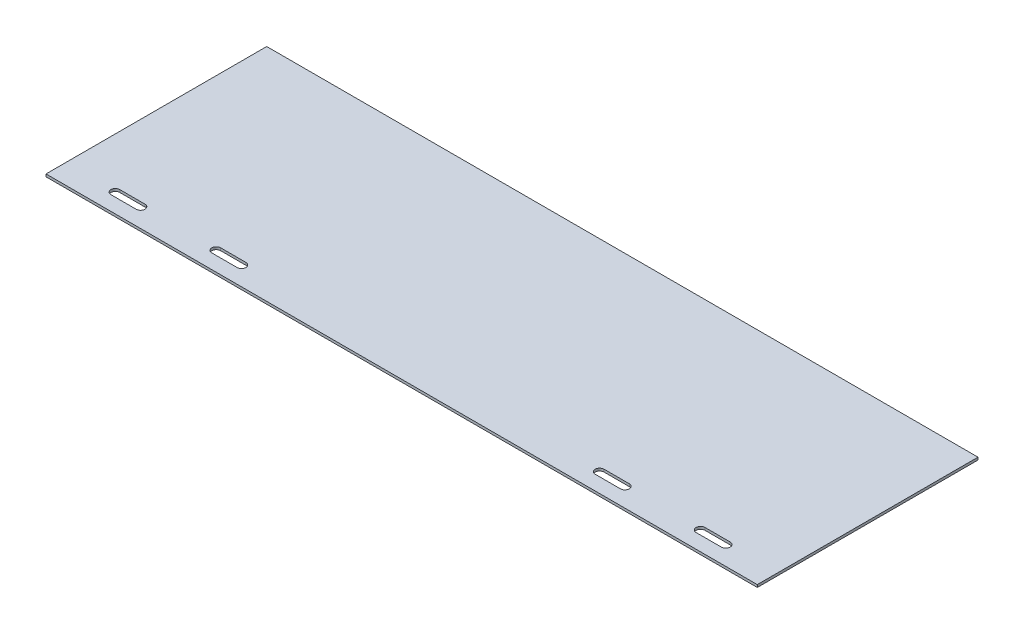
ISO-10303-21;
HEADER;
FILE_DESCRIPTION(('STEP AP214'),'2;1');
FILE_NAME('part.step','',(''),(''),'','','');
FILE_SCHEMA(('AUTOMOTIVE_DESIGN { 1 0 10303 214 1 1 1 1 }'));
ENDSEC;
DATA;
#1=APPLICATION_CONTEXT('core data for automotive mechanical design processes');
#2=APPLICATION_PROTOCOL_DEFINITION('international standard','automotive_design',2000,#1);
#3=PRODUCT_CONTEXT('',#1,'mechanical');
#4=PRODUCT('Part','Part','',(#3));
#5=PRODUCT_RELATED_PRODUCT_CATEGORY('part','',(#4));
#6=PRODUCT_DEFINITION_FORMATION('','',#4);
#7=PRODUCT_DEFINITION_CONTEXT('part definition',#1,'design');
#8=PRODUCT_DEFINITION('design','',#6,#7);
#9=PRODUCT_DEFINITION_SHAPE('','',#8);
#10=(LENGTH_UNIT() NAMED_UNIT(*) SI_UNIT(.MILLI.,.METRE.));
#11=(NAMED_UNIT(*) PLANE_ANGLE_UNIT() SI_UNIT($,.RADIAN.));
#12=(NAMED_UNIT(*) SI_UNIT($,.STERADIAN.) SOLID_ANGLE_UNIT());
#13=UNCERTAINTY_MEASURE_WITH_UNIT(LENGTH_MEASURE(1.E-05),#10,'distance_accuracy_value','');
#14=(GEOMETRIC_REPRESENTATION_CONTEXT(3) GLOBAL_UNCERTAINTY_ASSIGNED_CONTEXT((#13)) GLOBAL_UNIT_ASSIGNED_CONTEXT((#10,
#11,#12)) REPRESENTATION_CONTEXT('',''));
#15=CARTESIAN_POINT('',(0.,0.,0.));
#16=DIRECTION('',(0.,0.,1.));
#17=DIRECTION('',(1.,0.,0.));
#18=AXIS2_PLACEMENT_3D('',#15,#16,#17);
#19=CARTESIAN_POINT('',(0.,2.,0.));
#20=DIRECTION('',(0.,-1.,0.));
#21=DIRECTION('',(0.,0.,-1.));
#22=AXIS2_PLACEMENT_3D('',#19,#20,#21);
#23=PLANE('',#22);
#24=CARTESIAN_POINT('',(-242.,2.,72.5));
#25=DIRECTION('',(0.,1.,0.));
#26=DIRECTION('',(0.,0.,-1.));
#27=AXIS2_PLACEMENT_3D('',#24,#25,#26);
#28=CIRCLE('',#27,3.5);
#29=CARTESIAN_POINT('',(-242.,2.,69.));
#30=VERTEX_POINT('',#29);
#31=CARTESIAN_POINT('',(-242.,2.,76.));
#32=VERTEX_POINT('',#31);
#33=EDGE_CURVE('E188',#30,#32,#28,.T.);
#34=ORIENTED_EDGE('',*,*,#33,.F.);
#35=DIRECTION('',(-1.,0.,0.));
#36=VECTOR('',#35,1.);
#37=CARTESIAN_POINT('',(-242.,2.,69.));
#38=LINE('',#37,#36);
#39=CARTESIAN_POINT('',(-222.,2.,69.));
#40=VERTEX_POINT('',#39);
#41=EDGE_CURVE('E190',#40,#30,#38,.T.);
#42=ORIENTED_EDGE('',*,*,#41,.F.);
#43=CARTESIAN_POINT('',(-222.,2.,72.5));
#44=DIRECTION('',(0.,1.,0.));
#45=DIRECTION('',(0.,0.,-1.));
#46=AXIS2_PLACEMENT_3D('',#43,#44,#45);
#47=CIRCLE('',#46,3.5);
#48=CARTESIAN_POINT('',(-222.,2.,76.));
#49=VERTEX_POINT('',#48);
#50=EDGE_CURVE('E193',#49,#40,#47,.T.);
#51=ORIENTED_EDGE('',*,*,#50,.F.);
#52=DIRECTION('',(1.,0.,0.));
#53=VECTOR('',#52,1.);
#54=CARTESIAN_POINT('',(-242.,2.,76.));
#55=LINE('',#54,#53);
#56=EDGE_CURVE('E196',#32,#49,#55,.T.);
#57=ORIENTED_EDGE('',*,*,#56,.F.);
#58=EDGE_LOOP('',(#34,#42,#51,#57));
#59=FACE_BOUND('',#58,.T.);
#60=DIRECTION('',(1.,0.,0.));
#61=VECTOR('',#60,1.);
#62=CARTESIAN_POINT('',(162.,2.,69.));
#63=LINE('',#62,#61);
#64=CARTESIAN_POINT('',(142.,2.,69.));
#65=VERTEX_POINT('',#64);
#66=CARTESIAN_POINT('',(162.,2.,69.));
#67=VERTEX_POINT('',#66);
#68=EDGE_CURVE('E229',#65,#67,#63,.T.);
#69=ORIENTED_EDGE('',*,*,#68,.T.);
#70=CARTESIAN_POINT('',(162.,2.,72.5));
#71=DIRECTION('',(0.,-1.,0.));
#72=DIRECTION('',(0.,0.,-1.));
#73=AXIS2_PLACEMENT_3D('',#70,#71,#72);
#74=CIRCLE('',#73,3.5);
#75=CARTESIAN_POINT('',(162.,2.,76.));
#76=VERTEX_POINT('',#75);
#77=EDGE_CURVE('E219',#67,#76,#74,.T.);
#78=ORIENTED_EDGE('',*,*,#77,.T.);
#79=DIRECTION('',(-1.,0.,0.));
#80=VECTOR('',#79,1.);
#81=CARTESIAN_POINT('',(162.,2.,76.));
#82=LINE('',#81,#80);
#83=CARTESIAN_POINT('',(142.,2.,76.));
#84=VERTEX_POINT('',#83);
#85=EDGE_CURVE('E222',#76,#84,#82,.T.);
#86=ORIENTED_EDGE('',*,*,#85,.T.);
#87=CARTESIAN_POINT('',(142.,2.,72.5));
#88=DIRECTION('',(0.,-1.,0.));
#89=DIRECTION('',(0.,0.,-1.));
#90=AXIS2_PLACEMENT_3D('',#87,#88,#89);
#91=CIRCLE('',#90,3.5);
#92=EDGE_CURVE('E226',#84,#65,#91,.T.);
#93=ORIENTED_EDGE('',*,*,#92,.T.);
#94=EDGE_LOOP('',(#69,#78,#86,#93));
#95=FACE_BOUND('',#94,.T.);
#96=DIRECTION('',(1.,0.,0.));
#97=VECTOR('',#96,1.);
#98=CARTESIAN_POINT('',(242.,2.,69.));
#99=LINE('',#98,#97);
#100=CARTESIAN_POINT('',(222.,2.,69.));
#101=VERTEX_POINT('',#100);
#102=CARTESIAN_POINT('',(242.,2.,69.));
#103=VERTEX_POINT('',#102);
#104=EDGE_CURVE('E261',#101,#103,#99,.T.);
#105=ORIENTED_EDGE('',*,*,#104,.T.);
#106=CARTESIAN_POINT('',(242.,2.,72.5));
#107=DIRECTION('',(0.,-1.,0.));
#108=DIRECTION('',(0.,0.,-1.));
#109=AXIS2_PLACEMENT_3D('',#106,#107,#108);
#110=CIRCLE('',#109,3.5);
#111=CARTESIAN_POINT('',(242.,2.,76.));
#112=VERTEX_POINT('',#111);
#113=EDGE_CURVE('E251',#103,#112,#110,.T.);
#114=ORIENTED_EDGE('',*,*,#113,.T.);
#115=DIRECTION('',(-1.,0.,0.));
#116=VECTOR('',#115,1.);
#117=CARTESIAN_POINT('',(242.,2.,76.));
#118=LINE('',#117,#116);
#119=CARTESIAN_POINT('',(222.,2.,76.));
#120=VERTEX_POINT('',#119);
#121=EDGE_CURVE('E254',#112,#120,#118,.T.);
#122=ORIENTED_EDGE('',*,*,#121,.T.);
#123=CARTESIAN_POINT('',(222.,2.,72.5));
#124=DIRECTION('',(0.,-1.,0.));
#125=DIRECTION('',(0.,0.,-1.));
#126=AXIS2_PLACEMENT_3D('',#123,#124,#125);
#127=CIRCLE('',#126,3.5);
#128=EDGE_CURVE('E258',#120,#101,#127,.T.);
#129=ORIENTED_EDGE('',*,*,#128,.T.);
#130=EDGE_LOOP('',(#105,#114,#122,#129));
#131=FACE_BOUND('',#130,.T.);
#132=DIRECTION('',(0.,0.,-1.));
#133=VECTOR('',#132,1.);
#134=CARTESIAN_POINT('',(282.,2.,87.5));
#135=LINE('',#134,#133);
#136=CARTESIAN_POINT('',(282.,2.,87.5));
#137=VERTEX_POINT('',#136);
#138=CARTESIAN_POINT('',(282.,2.,-87.5));
#139=VERTEX_POINT('',#138);
#140=EDGE_CURVE('E283',#137,#139,#135,.T.);
#141=ORIENTED_EDGE('',*,*,#140,.T.);
#142=DIRECTION('',(-1.,0.,0.));
#143=VECTOR('',#142,1.);
#144=CARTESIAN_POINT('',(-282.,2.,-87.5));
#145=LINE('',#144,#143);
#146=CARTESIAN_POINT('',(-282.,2.,-87.5));
#147=VERTEX_POINT('',#146);
#148=EDGE_CURVE('E286',#139,#147,#145,.T.);
#149=ORIENTED_EDGE('',*,*,#148,.T.);
#150=DIRECTION('',(0.,0.,1.));
#151=VECTOR('',#150,1.);
#152=CARTESIAN_POINT('',(-282.,2.,87.5));
#153=LINE('',#152,#151);
#154=CARTESIAN_POINT('',(-282.,2.,87.5));
#155=VERTEX_POINT('',#154);
#156=EDGE_CURVE('E289',#147,#155,#153,.T.);
#157=ORIENTED_EDGE('',*,*,#156,.T.);
#158=DIRECTION('',(1.,0.,0.));
#159=VECTOR('',#158,1.);
#160=CARTESIAN_POINT('',(-282.,2.,87.5));
#161=LINE('',#160,#159);
#162=EDGE_CURVE('E291',#155,#137,#161,.T.);
#163=ORIENTED_EDGE('',*,*,#162,.T.);
#164=EDGE_LOOP('',(#141,#149,#157,#163));
#165=FACE_BOUND('',#164,.T.);
#166=CARTESIAN_POINT('',(-162.,2.,72.5));
#167=DIRECTION('',(0.,1.,0.));
#168=DIRECTION('',(0.,0.,-1.));
#169=AXIS2_PLACEMENT_3D('',#166,#167,#168);
#170=CIRCLE('',#169,3.5);
#171=CARTESIAN_POINT('',(-162.,2.,69.));
#172=VERTEX_POINT('',#171);
#173=CARTESIAN_POINT('',(-162.,2.,76.));
#174=VERTEX_POINT('',#173);
#175=EDGE_CURVE('E162',#172,#174,#170,.T.);
#176=ORIENTED_EDGE('',*,*,#175,.F.);
#177=DIRECTION('',(-1.,0.,0.));
#178=VECTOR('',#177,1.);
#179=CARTESIAN_POINT('',(-162.,2.,69.));
#180=LINE('',#179,#178);
#181=CARTESIAN_POINT('',(-142.,2.,69.));
#182=VERTEX_POINT('',#181);
#183=EDGE_CURVE('E154',#182,#172,#180,.T.);
#184=ORIENTED_EDGE('',*,*,#183,.F.);
#185=CARTESIAN_POINT('',(-142.,2.,72.5));
#186=DIRECTION('',(0.,1.,0.));
#187=DIRECTION('',(0.,0.,-1.));
#188=AXIS2_PLACEMENT_3D('',#185,#186,#187);
#189=CIRCLE('',#188,3.5);
#190=CARTESIAN_POINT('',(-142.,2.,76.));
#191=VERTEX_POINT('',#190);
#192=EDGE_CURVE('E161',#191,#182,#189,.T.);
#193=ORIENTED_EDGE('',*,*,#192,.F.);
#194=DIRECTION('',(1.,0.,0.));
#195=VECTOR('',#194,1.);
#196=CARTESIAN_POINT('',(-162.,2.,76.));
#197=LINE('',#196,#195);
#198=EDGE_CURVE('E166',#174,#191,#197,.T.);
#199=ORIENTED_EDGE('',*,*,#198,.F.);
#200=EDGE_LOOP('',(#176,#184,#193,#199));
#201=FACE_BOUND('',#200,.T.);
#202=ADVANCED_FACE('F17',(#59,#95,#131,#165,#201),#23,.F.);
#203=CARTESIAN_POINT('',(0.,0.,0.));
#204=DIRECTION('',(0.,-1.,0.));
#205=DIRECTION('',(0.,0.,-1.));
#206=AXIS2_PLACEMENT_3D('',#203,#204,#205);
#207=PLANE('',#206);
#208=DIRECTION('',(-1.,0.,0.));
#209=VECTOR('',#208,1.);
#210=CARTESIAN_POINT('',(-242.,0.,69.));
#211=LINE('',#210,#209);
#212=CARTESIAN_POINT('',(-222.,0.,69.));
#213=VERTEX_POINT('',#212);
#214=CARTESIAN_POINT('',(-242.,0.,69.));
#215=VERTEX_POINT('',#214);
#216=EDGE_CURVE('E201',#213,#215,#211,.T.);
#217=ORIENTED_EDGE('',*,*,#216,.T.);
#218=CARTESIAN_POINT('',(-242.,0.,72.5));
#219=DIRECTION('',(0.,1.,0.));
#220=DIRECTION('',(0.,0.,-1.));
#221=AXIS2_PLACEMENT_3D('',#218,#219,#220);
#222=CIRCLE('',#221,3.5);
#223=CARTESIAN_POINT('',(-242.,0.,76.));
#224=VERTEX_POINT('',#223);
#225=EDGE_CURVE('E184',#215,#224,#222,.T.);
#226=ORIENTED_EDGE('',*,*,#225,.T.);
#227=DIRECTION('',(1.,0.,0.));
#228=VECTOR('',#227,1.);
#229=CARTESIAN_POINT('',(-242.,0.,76.));
#230=LINE('',#229,#228);
#231=CARTESIAN_POINT('',(-222.,0.,76.));
#232=VERTEX_POINT('',#231);
#233=EDGE_CURVE('E191',#224,#232,#230,.T.);
#234=ORIENTED_EDGE('',*,*,#233,.T.);
#235=CARTESIAN_POINT('',(-222.,0.,72.5));
#236=DIRECTION('',(0.,1.,0.));
#237=DIRECTION('',(0.,0.,-1.));
#238=AXIS2_PLACEMENT_3D('',#235,#236,#237);
#239=CIRCLE('',#238,3.5);
#240=EDGE_CURVE('E204',#232,#213,#239,.T.);
#241=ORIENTED_EDGE('',*,*,#240,.T.);
#242=EDGE_LOOP('',(#217,#226,#234,#241));
#243=FACE_BOUND('',#242,.T.);
#244=CARTESIAN_POINT('',(162.,0.,72.5));
#245=DIRECTION('',(0.,-1.,0.));
#246=DIRECTION('',(0.,0.,-1.));
#247=AXIS2_PLACEMENT_3D('',#244,#245,#246);
#248=CIRCLE('',#247,3.5);
#249=CARTESIAN_POINT('',(162.,0.,69.));
#250=VERTEX_POINT('',#249);
#251=CARTESIAN_POINT('',(162.,0.,76.));
#252=VERTEX_POINT('',#251);
#253=EDGE_CURVE('E212',#250,#252,#248,.T.);
#254=ORIENTED_EDGE('',*,*,#253,.F.);
#255=DIRECTION('',(1.,0.,0.));
#256=VECTOR('',#255,1.);
#257=CARTESIAN_POINT('',(162.,0.,69.));
#258=LINE('',#257,#256);
#259=CARTESIAN_POINT('',(142.,0.,69.));
#260=VERTEX_POINT('',#259);
#261=EDGE_CURVE('E223',#260,#250,#258,.T.);
#262=ORIENTED_EDGE('',*,*,#261,.F.);
#263=CARTESIAN_POINT('',(142.,0.,72.5));
#264=DIRECTION('',(0.,-1.,0.));
#265=DIRECTION('',(0.,0.,-1.));
#266=AXIS2_PLACEMENT_3D('',#263,#264,#265);
#267=CIRCLE('',#266,3.5);
#268=CARTESIAN_POINT('',(142.,0.,76.));
#269=VERTEX_POINT('',#268);
#270=EDGE_CURVE('E237',#269,#260,#267,.T.);
#271=ORIENTED_EDGE('',*,*,#270,.F.);
#272=DIRECTION('',(-1.,0.,0.));
#273=VECTOR('',#272,1.);
#274=CARTESIAN_POINT('',(162.,0.,76.));
#275=LINE('',#274,#273);
#276=EDGE_CURVE('E234',#252,#269,#275,.T.);
#277=ORIENTED_EDGE('',*,*,#276,.F.);
#278=EDGE_LOOP('',(#254,#262,#271,#277));
#279=FACE_BOUND('',#278,.T.);
#280=CARTESIAN_POINT('',(242.,0.,72.5));
#281=DIRECTION('',(0.,-1.,0.));
#282=DIRECTION('',(0.,0.,-1.));
#283=AXIS2_PLACEMENT_3D('',#280,#281,#282);
#284=CIRCLE('',#283,3.5);
#285=CARTESIAN_POINT('',(242.,0.,69.));
#286=VERTEX_POINT('',#285);
#287=CARTESIAN_POINT('',(242.,0.,76.));
#288=VERTEX_POINT('',#287);
#289=EDGE_CURVE('E244',#286,#288,#284,.T.);
#290=ORIENTED_EDGE('',*,*,#289,.F.);
#291=DIRECTION('',(1.,0.,0.));
#292=VECTOR('',#291,1.);
#293=CARTESIAN_POINT('',(242.,0.,69.));
#294=LINE('',#293,#292);
#295=CARTESIAN_POINT('',(222.,0.,69.));
#296=VERTEX_POINT('',#295);
#297=EDGE_CURVE('E255',#296,#286,#294,.T.);
#298=ORIENTED_EDGE('',*,*,#297,.F.);
#299=CARTESIAN_POINT('',(222.,0.,72.5));
#300=DIRECTION('',(0.,-1.,0.));
#301=DIRECTION('',(0.,0.,-1.));
#302=AXIS2_PLACEMENT_3D('',#299,#300,#301);
#303=CIRCLE('',#302,3.5);
#304=CARTESIAN_POINT('',(222.,0.,76.));
#305=VERTEX_POINT('',#304);
#306=EDGE_CURVE('E269',#305,#296,#303,.T.);
#307=ORIENTED_EDGE('',*,*,#306,.F.);
#308=DIRECTION('',(-1.,0.,0.));
#309=VECTOR('',#308,1.);
#310=CARTESIAN_POINT('',(242.,0.,76.));
#311=LINE('',#310,#309);
#312=EDGE_CURVE('E266',#288,#305,#311,.T.);
#313=ORIENTED_EDGE('',*,*,#312,.F.);
#314=EDGE_LOOP('',(#290,#298,#307,#313));
#315=FACE_BOUND('',#314,.T.);
#316=DIRECTION('',(0.,0.,-1.));
#317=VECTOR('',#316,1.);
#318=CARTESIAN_POINT('',(282.,0.,87.5));
#319=LINE('',#318,#317);
#320=CARTESIAN_POINT('',(282.,0.,87.5));
#321=VERTEX_POINT('',#320);
#322=CARTESIAN_POINT('',(282.,0.,-87.5));
#323=VERTEX_POINT('',#322);
#324=EDGE_CURVE('E276',#321,#323,#319,.T.);
#325=ORIENTED_EDGE('',*,*,#324,.F.);
#326=DIRECTION('',(1.,0.,0.));
#327=VECTOR('',#326,1.);
#328=CARTESIAN_POINT('',(-282.,0.,87.5));
#329=LINE('',#328,#327);
#330=CARTESIAN_POINT('',(-282.,0.,87.5));
#331=VERTEX_POINT('',#330);
#332=EDGE_CURVE('E287',#331,#321,#329,.T.);
#333=ORIENTED_EDGE('',*,*,#332,.F.);
#334=DIRECTION('',(0.,0.,1.));
#335=VECTOR('',#334,1.);
#336=CARTESIAN_POINT('',(-282.,0.,87.5));
#337=LINE('',#336,#335);
#338=CARTESIAN_POINT('',(-282.,0.,-87.5));
#339=VERTEX_POINT('',#338);
#340=EDGE_CURVE('E298',#339,#331,#337,.T.);
#341=ORIENTED_EDGE('',*,*,#340,.F.);
#342=DIRECTION('',(-1.,0.,0.));
#343=VECTOR('',#342,1.);
#344=CARTESIAN_POINT('',(-282.,0.,-87.5));
#345=LINE('',#344,#343);
#346=EDGE_CURVE('E296',#323,#339,#345,.T.);
#347=ORIENTED_EDGE('',*,*,#346,.F.);
#348=EDGE_LOOP('',(#325,#333,#341,#347));
#349=FACE_BOUND('',#348,.T.);
#350=DIRECTION('',(-1.,0.,0.));
#351=VECTOR('',#350,1.);
#352=CARTESIAN_POINT('',(-162.,0.,69.));
#353=LINE('',#352,#351);
#354=CARTESIAN_POINT('',(-142.,0.,69.));
#355=VERTEX_POINT('',#354);
#356=CARTESIAN_POINT('',(-162.,0.,69.));
#357=VERTEX_POINT('',#356);
#358=EDGE_CURVE('E178',#355,#357,#353,.T.);
#359=ORIENTED_EDGE('',*,*,#358,.T.);
#360=CARTESIAN_POINT('',(-162.,0.,72.5));
#361=DIRECTION('',(0.,1.,0.));
#362=DIRECTION('',(0.,0.,-1.));
#363=AXIS2_PLACEMENT_3D('',#360,#361,#362);
#364=CIRCLE('',#363,3.5);
#365=CARTESIAN_POINT('',(-162.,0.,76.));
#366=VERTEX_POINT('',#365);
#367=EDGE_CURVE('E40',#357,#366,#364,.T.);
#368=ORIENTED_EDGE('',*,*,#367,.T.);
#369=DIRECTION('',(1.,0.,0.));
#370=VECTOR('',#369,1.);
#371=CARTESIAN_POINT('',(-162.,0.,76.));
#372=LINE('',#371,#370);
#373=CARTESIAN_POINT('',(-142.,0.,76.));
#374=VERTEX_POINT('',#373);
#375=EDGE_CURVE('E169',#366,#374,#372,.T.);
#376=ORIENTED_EDGE('',*,*,#375,.T.);
#377=CARTESIAN_POINT('',(-142.,0.,72.5));
#378=DIRECTION('',(0.,1.,0.));
#379=DIRECTION('',(0.,0.,-1.));
#380=AXIS2_PLACEMENT_3D('',#377,#378,#379);
#381=CIRCLE('',#380,3.5);
#382=EDGE_CURVE('E172',#374,#355,#381,.T.);
#383=ORIENTED_EDGE('',*,*,#382,.T.);
#384=EDGE_LOOP('',(#359,#368,#376,#383));
#385=FACE_BOUND('',#384,.T.);
#386=ADVANCED_FACE('F316',(#243,#279,#315,#349,#385),#207,.T.);
#387=CARTESIAN_POINT('',(282.,2.,87.5));
#388=DIRECTION('',(-1.,0.,0.));
#389=DIRECTION('',(0.,0.,1.));
#390=AXIS2_PLACEMENT_3D('',#387,#388,#389);
#391=PLANE('',#390);
#392=ORIENTED_EDGE('',*,*,#324,.T.);
#393=DIRECTION('',(0.,-1.,0.));
#394=VECTOR('',#393,1.);
#395=CARTESIAN_POINT('',(282.,2.,-87.5));
#396=LINE('',#395,#394);
#397=EDGE_CURVE('E11',#139,#323,#396,.T.);
#398=ORIENTED_EDGE('',*,*,#397,.F.);
#399=ORIENTED_EDGE('',*,*,#140,.F.);
#400=DIRECTION('',(0.,-1.,0.));
#401=VECTOR('',#400,1.);
#402=CARTESIAN_POINT('',(282.,2.,87.5));
#403=LINE('',#402,#401);
#404=EDGE_CURVE('E293',#137,#321,#403,.T.);
#405=ORIENTED_EDGE('',*,*,#404,.T.);
#406=EDGE_LOOP('',(#392,#398,#399,#405));
#407=FACE_BOUND('',#406,.T.);
#408=ADVANCED_FACE('F19',(#407),#391,.F.);
#409=CARTESIAN_POINT('',(-282.,2.,-87.5));
#410=DIRECTION('',(0.,0.,1.));
#411=DIRECTION('',(1.,0.,0.));
#412=AXIS2_PLACEMENT_3D('',#409,#410,#411);
#413=PLANE('',#412);
#414=ORIENTED_EDGE('',*,*,#346,.T.);
#415=DIRECTION('',(0.,-1.,0.));
#416=VECTOR('',#415,1.);
#417=CARTESIAN_POINT('',(-282.,2.,-87.5));
#418=LINE('',#417,#416);
#419=EDGE_CURVE('E25',#147,#339,#418,.T.);
#420=ORIENTED_EDGE('',*,*,#419,.F.);
#421=ORIENTED_EDGE('',*,*,#148,.F.);
#422=ORIENTED_EDGE('',*,*,#397,.T.);
#423=EDGE_LOOP('',(#414,#420,#421,#422));
#424=FACE_BOUND('',#423,.T.);
#425=ADVANCED_FACE('F326',(#424),#413,.F.);
#426=CARTESIAN_POINT('',(-282.,2.,87.5));
#427=DIRECTION('',(1.,0.,0.));
#428=DIRECTION('',(0.,0.,-1.));
#429=AXIS2_PLACEMENT_3D('',#426,#427,#428);
#430=PLANE('',#429);
#431=ORIENTED_EDGE('',*,*,#340,.T.);
#432=DIRECTION('',(0.,-1.,0.));
#433=VECTOR('',#432,1.);
#434=CARTESIAN_POINT('',(-282.,2.,87.5));
#435=LINE('',#434,#433);
#436=EDGE_CURVE('E303',#155,#331,#435,.T.);
#437=ORIENTED_EDGE('',*,*,#436,.F.);
#438=ORIENTED_EDGE('',*,*,#156,.F.);
#439=ORIENTED_EDGE('',*,*,#419,.T.);
#440=EDGE_LOOP('',(#431,#437,#438,#439));
#441=FACE_BOUND('',#440,.T.);
#442=ADVANCED_FACE('F310',(#441),#430,.F.);
#443=CARTESIAN_POINT('',(-282.,2.,87.5));
#444=DIRECTION('',(0.,0.,-1.));
#445=DIRECTION('',(-1.,0.,0.));
#446=AXIS2_PLACEMENT_3D('',#443,#444,#445);
#447=PLANE('',#446);
#448=ORIENTED_EDGE('',*,*,#332,.T.);
#449=ORIENTED_EDGE('',*,*,#404,.F.);
#450=ORIENTED_EDGE('',*,*,#162,.F.);
#451=ORIENTED_EDGE('',*,*,#436,.T.);
#452=EDGE_LOOP('',(#448,#449,#450,#451));
#453=FACE_BOUND('',#452,.T.);
#454=ADVANCED_FACE('F320',(#453),#447,.F.);
#455=CARTESIAN_POINT('',(242.,2.,72.5));
#456=DIRECTION('',(0.,-1.,0.));
#457=DIRECTION('',(0.,0.,-1.));
#458=AXIS2_PLACEMENT_3D('',#455,#456,#457);
#459=CYLINDRICAL_SURFACE('',#458,3.5);
#460=ORIENTED_EDGE('',*,*,#289,.T.);
#461=DIRECTION('',(0.,-1.,0.));
#462=VECTOR('',#461,1.);
#463=CARTESIAN_POINT('',(242.,2.,76.));
#464=LINE('',#463,#462);
#465=EDGE_CURVE('E264',#112,#288,#464,.T.);
#466=ORIENTED_EDGE('',*,*,#465,.F.);
#467=ORIENTED_EDGE('',*,*,#113,.F.);
#468=DIRECTION('',(0.,-1.,0.));
#469=VECTOR('',#468,1.);
#470=CARTESIAN_POINT('',(242.,2.,69.));
#471=LINE('',#470,#469);
#472=EDGE_CURVE('E274',#103,#286,#471,.T.);
#473=ORIENTED_EDGE('',*,*,#472,.T.);
#474=EDGE_LOOP('',(#460,#466,#467,#473));
#475=FACE_BOUND('',#474,.T.);
#476=ADVANCED_FACE('F347',(#475),#459,.F.);
#477=CARTESIAN_POINT('',(242.,2.,69.));
#478=DIRECTION('',(0.,0.,-1.));
#479=DIRECTION('',(-1.,0.,0.));
#480=AXIS2_PLACEMENT_3D('',#477,#478,#479);
#481=PLANE('',#480);
#482=ORIENTED_EDGE('',*,*,#297,.T.);
#483=ORIENTED_EDGE('',*,*,#472,.F.);
#484=ORIENTED_EDGE('',*,*,#104,.F.);
#485=DIRECTION('',(0.,-1.,0.));
#486=VECTOR('',#485,1.);
#487=CARTESIAN_POINT('',(222.,2.,69.));
#488=LINE('',#487,#486);
#489=EDGE_CURVE('E277',#101,#296,#488,.T.);
#490=ORIENTED_EDGE('',*,*,#489,.T.);
#491=EDGE_LOOP('',(#482,#483,#484,#490));
#492=FACE_BOUND('',#491,.T.);
#493=ADVANCED_FACE('F355',(#492),#481,.F.);
#494=CARTESIAN_POINT('',(222.,2.,72.5));
#495=DIRECTION('',(0.,-1.,0.));
#496=DIRECTION('',(0.,0.,-1.));
#497=AXIS2_PLACEMENT_3D('',#494,#495,#496);
#498=CYLINDRICAL_SURFACE('',#497,3.5);
#499=ORIENTED_EDGE('',*,*,#306,.T.);
#500=ORIENTED_EDGE('',*,*,#489,.F.);
#501=ORIENTED_EDGE('',*,*,#128,.F.);
#502=DIRECTION('',(0.,-1.,0.));
#503=VECTOR('',#502,1.);
#504=CARTESIAN_POINT('',(222.,2.,76.));
#505=LINE('',#504,#503);
#506=EDGE_CURVE('E279',#120,#305,#505,.T.);
#507=ORIENTED_EDGE('',*,*,#506,.T.);
#508=EDGE_LOOP('',(#499,#500,#501,#507));
#509=FACE_BOUND('',#508,.T.);
#510=ADVANCED_FACE('F361',(#509),#498,.F.);
#511=CARTESIAN_POINT('',(242.,2.,76.));
#512=DIRECTION('',(0.,0.,1.));
#513=DIRECTION('',(1.,0.,0.));
#514=AXIS2_PLACEMENT_3D('',#511,#512,#513);
#515=PLANE('',#514);
#516=ORIENTED_EDGE('',*,*,#312,.T.);
#517=ORIENTED_EDGE('',*,*,#506,.F.);
#518=ORIENTED_EDGE('',*,*,#121,.F.);
#519=ORIENTED_EDGE('',*,*,#465,.T.);
#520=EDGE_LOOP('',(#516,#517,#518,#519));
#521=FACE_BOUND('',#520,.T.);
#522=ADVANCED_FACE('F371',(#521),#515,.F.);
#523=CARTESIAN_POINT('',(162.,2.,72.5));
#524=DIRECTION('',(0.,-1.,0.));
#525=DIRECTION('',(0.,0.,-1.));
#526=AXIS2_PLACEMENT_3D('',#523,#524,#525);
#527=CYLINDRICAL_SURFACE('',#526,3.5);
#528=ORIENTED_EDGE('',*,*,#253,.T.);
#529=DIRECTION('',(0.,-1.,0.));
#530=VECTOR('',#529,1.);
#531=CARTESIAN_POINT('',(162.,2.,76.));
#532=LINE('',#531,#530);
#533=EDGE_CURVE('E232',#76,#252,#532,.T.);
#534=ORIENTED_EDGE('',*,*,#533,.F.);
#535=ORIENTED_EDGE('',*,*,#77,.F.);
#536=DIRECTION('',(0.,-1.,0.));
#537=VECTOR('',#536,1.);
#538=CARTESIAN_POINT('',(162.,2.,69.));
#539=LINE('',#538,#537);
#540=EDGE_CURVE('E242',#67,#250,#539,.T.);
#541=ORIENTED_EDGE('',*,*,#540,.T.);
#542=EDGE_LOOP('',(#528,#534,#535,#541));
#543=FACE_BOUND('',#542,.T.);
#544=ADVANCED_FACE('F383',(#543),#527,.F.);
#545=CARTESIAN_POINT('',(162.,2.,69.));
#546=DIRECTION('',(0.,0.,-1.));
#547=DIRECTION('',(-1.,0.,0.));
#548=AXIS2_PLACEMENT_3D('',#545,#546,#547);
#549=PLANE('',#548);
#550=ORIENTED_EDGE('',*,*,#261,.T.);
#551=ORIENTED_EDGE('',*,*,#540,.F.);
#552=ORIENTED_EDGE('',*,*,#68,.F.);
#553=DIRECTION('',(0.,-1.,0.));
#554=VECTOR('',#553,1.);
#555=CARTESIAN_POINT('',(142.,2.,69.));
#556=LINE('',#555,#554);
#557=EDGE_CURVE('E245',#65,#260,#556,.T.);
#558=ORIENTED_EDGE('',*,*,#557,.T.);
#559=EDGE_LOOP('',(#550,#551,#552,#558));
#560=FACE_BOUND('',#559,.T.);
#561=ADVANCED_FACE('F387',(#560),#549,.F.);
#562=CARTESIAN_POINT('',(142.,2.,72.5));
#563=DIRECTION('',(0.,-1.,0.));
#564=DIRECTION('',(0.,0.,-1.));
#565=AXIS2_PLACEMENT_3D('',#562,#563,#564);
#566=CYLINDRICAL_SURFACE('',#565,3.5);
#567=ORIENTED_EDGE('',*,*,#270,.T.);
#568=ORIENTED_EDGE('',*,*,#557,.F.);
#569=ORIENTED_EDGE('',*,*,#92,.F.);
#570=DIRECTION('',(0.,-1.,0.));
#571=VECTOR('',#570,1.);
#572=CARTESIAN_POINT('',(142.,2.,76.));
#573=LINE('',#572,#571);
#574=EDGE_CURVE('E247',#84,#269,#573,.T.);
#575=ORIENTED_EDGE('',*,*,#574,.T.);
#576=EDGE_LOOP('',(#567,#568,#569,#575));
#577=FACE_BOUND('',#576,.T.);
#578=ADVANCED_FACE('F393',(#577),#566,.F.);
#579=CARTESIAN_POINT('',(162.,2.,76.));
#580=DIRECTION('',(0.,0.,1.));
#581=DIRECTION('',(1.,0.,0.));
#582=AXIS2_PLACEMENT_3D('',#579,#580,#581);
#583=PLANE('',#582);
#584=ORIENTED_EDGE('',*,*,#276,.T.);
#585=ORIENTED_EDGE('',*,*,#574,.F.);
#586=ORIENTED_EDGE('',*,*,#85,.F.);
#587=ORIENTED_EDGE('',*,*,#533,.T.);
#588=EDGE_LOOP('',(#584,#585,#586,#587));
#589=FACE_BOUND('',#588,.T.);
#590=ADVANCED_FACE('F389',(#589),#583,.F.);
#591=CARTESIAN_POINT('',(-242.,2.,72.5));
#592=DIRECTION('',(0.,-1.,0.));
#593=DIRECTION('',(0.,0.,-1.));
#594=AXIS2_PLACEMENT_3D('',#591,#592,#593);
#595=CYLINDRICAL_SURFACE('',#594,3.5);
#596=ORIENTED_EDGE('',*,*,#225,.F.);
#597=DIRECTION('',(0.,-1.,0.));
#598=VECTOR('',#597,1.);
#599=CARTESIAN_POINT('',(-242.,2.,69.));
#600=LINE('',#599,#598);
#601=EDGE_CURVE('E198',#30,#215,#600,.T.);
#602=ORIENTED_EDGE('',*,*,#601,.F.);
#603=ORIENTED_EDGE('',*,*,#33,.T.);
#604=DIRECTION('',(0.,-1.,0.));
#605=VECTOR('',#604,1.);
#606=CARTESIAN_POINT('',(-242.,2.,76.));
#607=LINE('',#606,#605);
#608=EDGE_CURVE('E209',#32,#224,#607,.T.);
#609=ORIENTED_EDGE('',*,*,#608,.T.);
#610=EDGE_LOOP('',(#596,#602,#603,#609));
#611=FACE_BOUND('',#610,.T.);
#612=ADVANCED_FACE('F392',(#611),#595,.F.);
#613=CARTESIAN_POINT('',(-242.,2.,76.));
#614=DIRECTION('',(0.,0.,-1.));
#615=DIRECTION('',(-1.,0.,0.));
#616=AXIS2_PLACEMENT_3D('',#613,#614,#615);
#617=PLANE('',#616);
#618=ORIENTED_EDGE('',*,*,#233,.F.);
#619=ORIENTED_EDGE('',*,*,#608,.F.);
#620=ORIENTED_EDGE('',*,*,#56,.T.);
#621=DIRECTION('',(0.,-1.,0.));
#622=VECTOR('',#621,1.);
#623=CARTESIAN_POINT('',(-222.,2.,76.));
#624=LINE('',#623,#622);
#625=EDGE_CURVE('E213',#49,#232,#624,.T.);
#626=ORIENTED_EDGE('',*,*,#625,.T.);
#627=EDGE_LOOP('',(#618,#619,#620,#626));
#628=FACE_BOUND('',#627,.T.);
#629=ADVANCED_FACE('F403',(#628),#617,.T.);
#630=CARTESIAN_POINT('',(-222.,2.,72.5));
#631=DIRECTION('',(0.,-1.,0.));
#632=DIRECTION('',(0.,0.,-1.));
#633=AXIS2_PLACEMENT_3D('',#630,#631,#632);
#634=CYLINDRICAL_SURFACE('',#633,3.5);
#635=ORIENTED_EDGE('',*,*,#240,.F.);
#636=ORIENTED_EDGE('',*,*,#625,.F.);
#637=ORIENTED_EDGE('',*,*,#50,.T.);
#638=DIRECTION('',(0.,-1.,0.));
#639=VECTOR('',#638,1.);
#640=CARTESIAN_POINT('',(-222.,2.,69.));
#641=LINE('',#640,#639);
#642=EDGE_CURVE('E215',#40,#213,#641,.T.);
#643=ORIENTED_EDGE('',*,*,#642,.T.);
#644=EDGE_LOOP('',(#635,#636,#637,#643));
#645=FACE_BOUND('',#644,.T.);
#646=ADVANCED_FACE('F408',(#645),#634,.F.);
#647=CARTESIAN_POINT('',(-242.,2.,69.));
#648=DIRECTION('',(0.,0.,1.));
#649=DIRECTION('',(1.,0.,0.));
#650=AXIS2_PLACEMENT_3D('',#647,#648,#649);
#651=PLANE('',#650);
#652=ORIENTED_EDGE('',*,*,#216,.F.);
#653=ORIENTED_EDGE('',*,*,#642,.F.);
#654=ORIENTED_EDGE('',*,*,#41,.T.);
#655=ORIENTED_EDGE('',*,*,#601,.T.);
#656=EDGE_LOOP('',(#652,#653,#654,#655));
#657=FACE_BOUND('',#656,.T.);
#658=ADVANCED_FACE('F405',(#657),#651,.T.);
#659=CARTESIAN_POINT('',(-162.,2.,72.5));
#660=DIRECTION('',(0.,-1.,0.));
#661=DIRECTION('',(0.,0.,-1.));
#662=AXIS2_PLACEMENT_3D('',#659,#660,#661);
#663=CYLINDRICAL_SURFACE('',#662,3.5);
#664=ORIENTED_EDGE('',*,*,#367,.F.);
#665=DIRECTION('',(0.,-1.,0.));
#666=VECTOR('',#665,1.);
#667=CARTESIAN_POINT('',(-162.,2.,69.));
#668=LINE('',#667,#666);
#669=EDGE_CURVE('E156',#172,#357,#668,.T.);
#670=ORIENTED_EDGE('',*,*,#669,.F.);
#671=ORIENTED_EDGE('',*,*,#175,.T.);
#672=DIRECTION('',(0.,-1.,0.));
#673=VECTOR('',#672,1.);
#674=CARTESIAN_POINT('',(-162.,2.,76.));
#675=LINE('',#674,#673);
#676=EDGE_CURVE('E182',#174,#366,#675,.T.);
#677=ORIENTED_EDGE('',*,*,#676,.T.);
#678=EDGE_LOOP('',(#664,#670,#671,#677));
#679=FACE_BOUND('',#678,.T.);
#680=ADVANCED_FACE('F164',(#679),#663,.F.);
#681=CARTESIAN_POINT('',(-162.,2.,76.));
#682=DIRECTION('',(0.,0.,-1.));
#683=DIRECTION('',(-1.,0.,0.));
#684=AXIS2_PLACEMENT_3D('',#681,#682,#683);
#685=PLANE('',#684);
#686=ORIENTED_EDGE('',*,*,#375,.F.);
#687=ORIENTED_EDGE('',*,*,#676,.F.);
#688=ORIENTED_EDGE('',*,*,#198,.T.);
#689=DIRECTION('',(0.,-1.,0.));
#690=VECTOR('',#689,1.);
#691=CARTESIAN_POINT('',(-142.,2.,76.));
#692=LINE('',#691,#690);
#693=EDGE_CURVE('E185',#191,#374,#692,.T.);
#694=ORIENTED_EDGE('',*,*,#693,.T.);
#695=EDGE_LOOP('',(#686,#687,#688,#694));
#696=FACE_BOUND('',#695,.T.);
#697=ADVANCED_FACE('F418',(#696),#685,.T.);
#698=CARTESIAN_POINT('',(-142.,2.,72.5));
#699=DIRECTION('',(0.,-1.,0.));
#700=DIRECTION('',(0.,0.,-1.));
#701=AXIS2_PLACEMENT_3D('',#698,#699,#700);
#702=CYLINDRICAL_SURFACE('',#701,3.5);
#703=ORIENTED_EDGE('',*,*,#382,.F.);
#704=ORIENTED_EDGE('',*,*,#693,.F.);
#705=ORIENTED_EDGE('',*,*,#192,.T.);
#706=DIRECTION('',(0.,-1.,0.));
#707=VECTOR('',#706,1.);
#708=CARTESIAN_POINT('',(-142.,2.,69.));
#709=LINE('',#708,#707);
#710=EDGE_CURVE('E32',#182,#355,#709,.T.);
#711=ORIENTED_EDGE('',*,*,#710,.T.);
#712=EDGE_LOOP('',(#703,#704,#705,#711));
#713=FACE_BOUND('',#712,.T.);
#714=ADVANCED_FACE('F421',(#713),#702,.F.);
#715=CARTESIAN_POINT('',(-162.,2.,69.));
#716=DIRECTION('',(0.,0.,1.));
#717=DIRECTION('',(1.,0.,0.));
#718=AXIS2_PLACEMENT_3D('',#715,#716,#717);
#719=PLANE('',#718);
#720=ORIENTED_EDGE('',*,*,#358,.F.);
#721=ORIENTED_EDGE('',*,*,#710,.F.);
#722=ORIENTED_EDGE('',*,*,#183,.T.);
#723=ORIENTED_EDGE('',*,*,#669,.T.);
#724=EDGE_LOOP('',(#720,#721,#722,#723));
#725=FACE_BOUND('',#724,.T.);
#726=ADVANCED_FACE('F155',(#725),#719,.T.);
#727=CLOSED_SHELL('',(#202,#386,#408,#425,#442,#454,#476,#493,#510,#522,#544,#561,#578,#590,
#612,#629,#646,#658,#680,#697,#714,#726));
#728=MANIFOLD_SOLID_BREP('B1',#727);
#729=ADVANCED_BREP_SHAPE_REPRESENTATION('',(#18,#728),#14);
#730=SHAPE_DEFINITION_REPRESENTATION(#9,#729);
ENDSEC;
END-ISO-10303-21;
